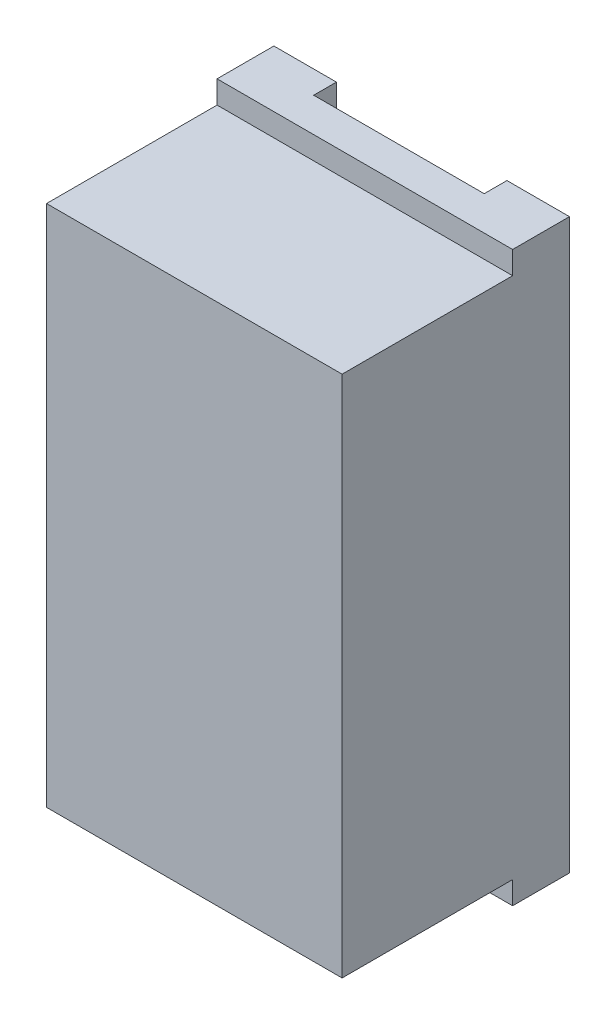
ISO-10303-21;
HEADER;
FILE_DESCRIPTION(('STEP AP214'),'2;1');
FILE_NAME('part.step','',(''),(''),'','','');
FILE_SCHEMA(('AUTOMOTIVE_DESIGN { 1 0 10303 214 1 1 1 1 }'));
ENDSEC;
DATA;
#1=APPLICATION_CONTEXT('core data for automotive mechanical design processes');
#2=APPLICATION_PROTOCOL_DEFINITION('international standard','automotive_design',2000,#1);
#3=PRODUCT_CONTEXT('',#1,'mechanical');
#4=PRODUCT('Part','Part','',(#3));
#5=PRODUCT_RELATED_PRODUCT_CATEGORY('part','',(#4));
#6=PRODUCT_DEFINITION_FORMATION('','',#4);
#7=PRODUCT_DEFINITION_CONTEXT('part definition',#1,'design');
#8=PRODUCT_DEFINITION('design','',#6,#7);
#9=PRODUCT_DEFINITION_SHAPE('','',#8);
#10=(LENGTH_UNIT() NAMED_UNIT(*) SI_UNIT(.MILLI.,.METRE.));
#11=(NAMED_UNIT(*) PLANE_ANGLE_UNIT() SI_UNIT($,.RADIAN.));
#12=(NAMED_UNIT(*) SI_UNIT($,.STERADIAN.) SOLID_ANGLE_UNIT());
#13=UNCERTAINTY_MEASURE_WITH_UNIT(LENGTH_MEASURE(1.E-05),#10,'distance_accuracy_value','');
#14=(GEOMETRIC_REPRESENTATION_CONTEXT(3) GLOBAL_UNCERTAINTY_ASSIGNED_CONTEXT((#13)) GLOBAL_UNIT_ASSIGNED_CONTEXT((#10,
#11,#12)) REPRESENTATION_CONTEXT('',''));
#15=CARTESIAN_POINT('',(0.,0.,0.));
#16=DIRECTION('',(0.,0.,1.));
#17=DIRECTION('',(1.,0.,0.));
#18=AXIS2_PLACEMENT_3D('',#15,#16,#17);
#19=CARTESIAN_POINT('',(13.,-48.,-20.));
#20=DIRECTION('',(0.,1.,0.));
#21=DIRECTION('',(0.,0.,1.));
#22=AXIS2_PLACEMENT_3D('',#19,#20,#21);
#23=PLANE('',#22);
#24=DIRECTION('',(0.,0.,-1.));
#25=VECTOR('',#24,1.);
#26=CARTESIAN_POINT('',(-7.5,-48.,-20.));
#27=LINE('',#26,#25);
#28=CARTESIAN_POINT('',(-7.5,-48.,-18.));
#29=VERTEX_POINT('',#28);
#30=CARTESIAN_POINT('',(-7.5,-48.,-20.));
#31=VERTEX_POINT('',#30);
#32=EDGE_CURVE('E210',#29,#31,#27,.T.);
#33=ORIENTED_EDGE('',*,*,#32,.F.);
#34=DIRECTION('',(1.,0.,0.));
#35=VECTOR('',#34,1.);
#36=CARTESIAN_POINT('',(13.,-48.,-18.));
#37=LINE('',#36,#35);
#38=CARTESIAN_POINT('',(7.5,-48.,-18.));
#39=VERTEX_POINT('',#38);
#40=EDGE_CURVE('E147',#29,#39,#37,.T.);
#41=ORIENTED_EDGE('',*,*,#40,.T.);
#42=DIRECTION('',(0.,0.,-1.));
#43=VECTOR('',#42,1.);
#44=CARTESIAN_POINT('',(7.5,-48.,-20.));
#45=LINE('',#44,#43);
#46=CARTESIAN_POINT('',(7.5,-48.,-20.));
#47=VERTEX_POINT('',#46);
#48=EDGE_CURVE('E201',#39,#47,#45,.T.);
#49=ORIENTED_EDGE('',*,*,#48,.T.);
#50=DIRECTION('',(-1.,0.,0.));
#51=VECTOR('',#50,1.);
#52=CARTESIAN_POINT('',(13.,-48.,-20.));
#53=LINE('',#52,#51);
#54=CARTESIAN_POINT('',(13.,-48.,-20.));
#55=VERTEX_POINT('',#54);
#56=EDGE_CURVE('E167',#55,#47,#53,.T.);
#57=ORIENTED_EDGE('',*,*,#56,.F.);
#58=DIRECTION('',(0.,0.,-1.));
#59=VECTOR('',#58,1.);
#60=CARTESIAN_POINT('',(13.,-48.,-20.));
#61=LINE('',#60,#59);
#62=CARTESIAN_POINT('',(13.,-48.,-15.));
#63=VERTEX_POINT('',#62);
#64=EDGE_CURVE('E217',#63,#55,#61,.T.);
#65=ORIENTED_EDGE('',*,*,#64,.F.);
#66=DIRECTION('',(-1.,0.,0.));
#67=VECTOR('',#66,1.);
#68=CARTESIAN_POINT('',(13.,-48.,-15.));
#69=LINE('',#68,#67);
#70=CARTESIAN_POINT('',(-13.,-48.,-15.));
#71=VERTEX_POINT('',#70);
#72=EDGE_CURVE('E170',#63,#71,#69,.T.);
#73=ORIENTED_EDGE('',*,*,#72,.T.);
#74=DIRECTION('',(0.,0.,-1.));
#75=VECTOR('',#74,1.);
#76=CARTESIAN_POINT('',(-13.,-48.,-20.));
#77=LINE('',#76,#75);
#78=CARTESIAN_POINT('',(-13.,-48.,-20.));
#79=VERTEX_POINT('',#78);
#80=EDGE_CURVE('E151',#71,#79,#77,.T.);
#81=ORIENTED_EDGE('',*,*,#80,.T.);
#82=EDGE_CURVE('E166',#31,#79,#53,.T.);
#83=ORIENTED_EDGE('',*,*,#82,.F.);
#84=EDGE_LOOP('',(#33,#41,#49,#57,#65,#73,#81,#83));
#85=FACE_BOUND('',#84,.T.);
#86=ADVANCED_FACE('F33',(#85),#23,.F.);
#87=CARTESIAN_POINT('',(13.,2.,-20.));
#88=DIRECTION('',(0.,0.,1.));
#89=DIRECTION('',(0.,-1.,0.));
#90=AXIS2_PLACEMENT_3D('',#87,#88,#89);
#91=PLANE('',#90);
#92=DIRECTION('',(0.,1.,0.));
#93=VECTOR('',#92,1.);
#94=CARTESIAN_POINT('',(-7.5,2.,-20.));
#95=LINE('',#94,#93);
#96=CARTESIAN_POINT('',(-7.5,2.,-20.));
#97=VERTEX_POINT('',#96);
#98=EDGE_CURVE('E207',#31,#97,#95,.T.);
#99=ORIENTED_EDGE('',*,*,#98,.F.);
#100=ORIENTED_EDGE('',*,*,#82,.T.);
#101=DIRECTION('',(0.,1.,0.));
#102=VECTOR('',#101,1.);
#103=CARTESIAN_POINT('',(-13.,2.,-20.));
#104=LINE('',#103,#102);
#105=CARTESIAN_POINT('',(-13.,2.,-20.));
#106=VERTEX_POINT('',#105);
#107=EDGE_CURVE('E154',#79,#106,#104,.T.);
#108=ORIENTED_EDGE('',*,*,#107,.T.);
#109=DIRECTION('',(-1.,0.,0.));
#110=VECTOR('',#109,1.);
#111=CARTESIAN_POINT('',(13.,2.,-20.));
#112=LINE('',#111,#110);
#113=EDGE_CURVE('E134',#97,#106,#112,.T.);
#114=ORIENTED_EDGE('',*,*,#113,.F.);
#115=EDGE_LOOP('',(#99,#100,#108,#114));
#116=FACE_BOUND('',#115,.T.);
#117=ADVANCED_FACE('F235',(#116),#91,.F.);
#118=CARTESIAN_POINT('',(13.,2.,-15.));
#119=DIRECTION('',(0.,-1.,0.));
#120=DIRECTION('',(0.,0.,-1.));
#121=AXIS2_PLACEMENT_3D('',#118,#119,#120);
#122=PLANE('',#121);
#123=DIRECTION('',(0.,0.,1.));
#124=VECTOR('',#123,1.);
#125=CARTESIAN_POINT('',(-7.5,2.,-15.));
#126=LINE('',#125,#124);
#127=CARTESIAN_POINT('',(-7.5,2.,-18.));
#128=VERTEX_POINT('',#127);
#129=EDGE_CURVE('E11',#97,#128,#126,.T.);
#130=ORIENTED_EDGE('',*,*,#129,.F.);
#131=ORIENTED_EDGE('',*,*,#113,.T.);
#132=DIRECTION('',(0.,0.,1.));
#133=VECTOR('',#132,1.);
#134=CARTESIAN_POINT('',(-13.,2.,-15.));
#135=LINE('',#134,#133);
#136=CARTESIAN_POINT('',(-13.,2.,-15.));
#137=VERTEX_POINT('',#136);
#138=EDGE_CURVE('E131',#106,#137,#135,.T.);
#139=ORIENTED_EDGE('',*,*,#138,.T.);
#140=DIRECTION('',(-1.,0.,0.));
#141=VECTOR('',#140,1.);
#142=CARTESIAN_POINT('',(13.,2.,-15.));
#143=LINE('',#142,#141);
#144=CARTESIAN_POINT('',(13.,2.,-15.));
#145=VERTEX_POINT('',#144);
#146=EDGE_CURVE('E127',#145,#137,#143,.T.);
#147=ORIENTED_EDGE('',*,*,#146,.F.);
#148=DIRECTION('',(0.,0.,1.));
#149=VECTOR('',#148,1.);
#150=CARTESIAN_POINT('',(13.,2.,-15.));
#151=LINE('',#150,#149);
#152=CARTESIAN_POINT('',(13.,2.,-20.));
#153=VERTEX_POINT('',#152);
#154=EDGE_CURVE('E114',#153,#145,#151,.T.);
#155=ORIENTED_EDGE('',*,*,#154,.F.);
#156=CARTESIAN_POINT('',(7.5,2.,-20.));
#157=VERTEX_POINT('',#156);
#158=EDGE_CURVE('E164',#153,#157,#112,.T.);
#159=ORIENTED_EDGE('',*,*,#158,.T.);
#160=DIRECTION('',(0.,0.,1.));
#161=VECTOR('',#160,1.);
#162=CARTESIAN_POINT('',(7.5,2.,-15.));
#163=LINE('',#162,#161);
#164=CARTESIAN_POINT('',(7.5,2.,-18.));
#165=VERTEX_POINT('',#164);
#166=EDGE_CURVE('E178',#157,#165,#163,.T.);
#167=ORIENTED_EDGE('',*,*,#166,.T.);
#168=DIRECTION('',(-1.,0.,0.));
#169=VECTOR('',#168,1.);
#170=CARTESIAN_POINT('',(13.,2.,-18.));
#171=LINE('',#170,#169);
#172=EDGE_CURVE('E41',#165,#128,#171,.T.);
#173=ORIENTED_EDGE('',*,*,#172,.T.);
#174=EDGE_LOOP('',(#130,#131,#139,#147,#155,#159,#167,#173));
#175=FACE_BOUND('',#174,.T.);
#176=ADVANCED_FACE('F129',(#175),#122,.F.);
#177=CARTESIAN_POINT('',(13.,-46.,0.));
#178=DIRECTION('',(0.,0.,-1.));
#179=DIRECTION('',(-1.,0.,0.));
#180=AXIS2_PLACEMENT_3D('',#177,#178,#179);
#181=PLANE('',#180);
#182=DIRECTION('',(0.,-1.,0.));
#183=VECTOR('',#182,1.);
#184=CARTESIAN_POINT('',(-13.,-46.,0.));
#185=LINE('',#184,#183);
#186=CARTESIAN_POINT('',(-13.,0.,0.));
#187=VERTEX_POINT('',#186);
#188=CARTESIAN_POINT('',(-13.,-46.,0.));
#189=VERTEX_POINT('',#188);
#190=EDGE_CURVE('E143',#187,#189,#185,.T.);
#191=ORIENTED_EDGE('',*,*,#190,.T.);
#192=DIRECTION('',(-1.,0.,0.));
#193=VECTOR('',#192,1.);
#194=CARTESIAN_POINT('',(13.,-46.,0.));
#195=LINE('',#194,#193);
#196=CARTESIAN_POINT('',(13.,-46.,0.));
#197=VERTEX_POINT('',#196);
#198=EDGE_CURVE('E176',#197,#189,#195,.T.);
#199=ORIENTED_EDGE('',*,*,#198,.F.);
#200=DIRECTION('',(0.,-1.,0.));
#201=VECTOR('',#200,1.);
#202=CARTESIAN_POINT('',(13.,-46.,0.));
#203=LINE('',#202,#201);
#204=CARTESIAN_POINT('',(13.,0.,0.));
#205=VERTEX_POINT('',#204);
#206=EDGE_CURVE('E161',#205,#197,#203,.T.);
#207=ORIENTED_EDGE('',*,*,#206,.F.);
#208=DIRECTION('',(-1.,0.,0.));
#209=VECTOR('',#208,1.);
#210=CARTESIAN_POINT('',(13.,0.,0.));
#211=LINE('',#210,#209);
#212=EDGE_CURVE('E139',#205,#187,#211,.T.);
#213=ORIENTED_EDGE('',*,*,#212,.T.);
#214=EDGE_LOOP('',(#191,#199,#207,#213));
#215=FACE_BOUND('',#214,.T.);
#216=ADVANCED_FACE('F35',(#215),#181,.F.);
#217=CARTESIAN_POINT('',(13.,-46.,-15.));
#218=DIRECTION('',(0.,1.,0.));
#219=DIRECTION('',(0.,0.,1.));
#220=AXIS2_PLACEMENT_3D('',#217,#218,#219);
#221=PLANE('',#220);
#222=DIRECTION('',(0.,0.,-1.));
#223=VECTOR('',#222,1.);
#224=CARTESIAN_POINT('',(-13.,-46.,-15.));
#225=LINE('',#224,#223);
#226=CARTESIAN_POINT('',(-13.,-46.,-15.));
#227=VERTEX_POINT('',#226);
#228=EDGE_CURVE('E146',#189,#227,#225,.T.);
#229=ORIENTED_EDGE('',*,*,#228,.T.);
#230=DIRECTION('',(-1.,0.,0.));
#231=VECTOR('',#230,1.);
#232=CARTESIAN_POINT('',(13.,-46.,-15.));
#233=LINE('',#232,#231);
#234=CARTESIAN_POINT('',(13.,-46.,-15.));
#235=VERTEX_POINT('',#234);
#236=EDGE_CURVE('E173',#235,#227,#233,.T.);
#237=ORIENTED_EDGE('',*,*,#236,.F.);
#238=DIRECTION('',(0.,0.,-1.));
#239=VECTOR('',#238,1.);
#240=CARTESIAN_POINT('',(13.,-46.,-15.));
#241=LINE('',#240,#239);
#242=EDGE_CURVE('E99',#197,#235,#241,.T.);
#243=ORIENTED_EDGE('',*,*,#242,.F.);
#244=ORIENTED_EDGE('',*,*,#198,.T.);
#245=EDGE_LOOP('',(#229,#237,#243,#244));
#246=FACE_BOUND('',#245,.T.);
#247=ADVANCED_FACE('F246',(#246),#221,.F.);
#248=CARTESIAN_POINT('',(13.,-48.,-15.));
#249=DIRECTION('',(0.,0.,-1.));
#250=DIRECTION('',(-1.,0.,0.));
#251=AXIS2_PLACEMENT_3D('',#248,#249,#250);
#252=PLANE('',#251);
#253=DIRECTION('',(0.,-1.,0.));
#254=VECTOR('',#253,1.);
#255=CARTESIAN_POINT('',(-13.,-48.,-15.));
#256=LINE('',#255,#254);
#257=EDGE_CURVE('E149',#227,#71,#256,.T.);
#258=ORIENTED_EDGE('',*,*,#257,.T.);
#259=ORIENTED_EDGE('',*,*,#72,.F.);
#260=DIRECTION('',(0.,-1.,0.));
#261=VECTOR('',#260,1.);
#262=CARTESIAN_POINT('',(13.,-48.,-15.));
#263=LINE('',#262,#261);
#264=EDGE_CURVE('E215',#235,#63,#263,.T.);
#265=ORIENTED_EDGE('',*,*,#264,.F.);
#266=ORIENTED_EDGE('',*,*,#236,.T.);
#267=EDGE_LOOP('',(#258,#259,#265,#266));
#268=FACE_BOUND('',#267,.T.);
#269=ADVANCED_FACE('F248',(#268),#252,.F.);
#270=ORIENTED_EDGE('',*,*,#56,.T.);
#271=DIRECTION('',(0.,1.,0.));
#272=VECTOR('',#271,1.);
#273=CARTESIAN_POINT('',(7.5,2.,-20.));
#274=LINE('',#273,#272);
#275=EDGE_CURVE('E198',#47,#157,#274,.T.);
#276=ORIENTED_EDGE('',*,*,#275,.T.);
#277=ORIENTED_EDGE('',*,*,#158,.F.);
#278=DIRECTION('',(0.,1.,0.));
#279=VECTOR('',#278,1.);
#280=CARTESIAN_POINT('',(13.,2.,-20.));
#281=LINE('',#280,#279);
#282=EDGE_CURVE('E121',#55,#153,#281,.T.);
#283=ORIENTED_EDGE('',*,*,#282,.F.);
#284=EDGE_LOOP('',(#270,#276,#277,#283));
#285=FACE_BOUND('',#284,.T.);
#286=ADVANCED_FACE('F224',(#285),#91,.F.);
#287=CARTESIAN_POINT('',(13.,0.,-15.));
#288=DIRECTION('',(0.,0.,-1.));
#289=DIRECTION('',(-1.,0.,0.));
#290=AXIS2_PLACEMENT_3D('',#287,#288,#289);
#291=PLANE('',#290);
#292=DIRECTION('',(0.,-1.,0.));
#293=VECTOR('',#292,1.);
#294=CARTESIAN_POINT('',(-13.,0.,-15.));
#295=LINE('',#294,#293);
#296=CARTESIAN_POINT('',(-13.,0.,-15.));
#297=VERTEX_POINT('',#296);
#298=EDGE_CURVE('E158',#137,#297,#295,.T.);
#299=ORIENTED_EDGE('',*,*,#298,.T.);
#300=DIRECTION('',(-1.,0.,0.));
#301=VECTOR('',#300,1.);
#302=CARTESIAN_POINT('',(13.,0.,-15.));
#303=LINE('',#302,#301);
#304=CARTESIAN_POINT('',(13.,0.,-15.));
#305=VERTEX_POINT('',#304);
#306=EDGE_CURVE('E135',#305,#297,#303,.T.);
#307=ORIENTED_EDGE('',*,*,#306,.F.);
#308=DIRECTION('',(0.,-1.,0.));
#309=VECTOR('',#308,1.);
#310=CARTESIAN_POINT('',(13.,0.,-15.));
#311=LINE('',#310,#309);
#312=EDGE_CURVE('E118',#145,#305,#311,.T.);
#313=ORIENTED_EDGE('',*,*,#312,.F.);
#314=ORIENTED_EDGE('',*,*,#146,.T.);
#315=EDGE_LOOP('',(#299,#307,#313,#314));
#316=FACE_BOUND('',#315,.T.);
#317=ADVANCED_FACE('F137',(#316),#291,.F.);
#318=CARTESIAN_POINT('',(13.,0.,0.));
#319=DIRECTION('',(0.,-1.,0.));
#320=DIRECTION('',(0.,0.,-1.));
#321=AXIS2_PLACEMENT_3D('',#318,#319,#320);
#322=PLANE('',#321);
#323=DIRECTION('',(0.,0.,1.));
#324=VECTOR('',#323,1.);
#325=CARTESIAN_POINT('',(-13.,0.,0.));
#326=LINE('',#325,#324);
#327=EDGE_CURVE('E90',#297,#187,#326,.T.);
#328=ORIENTED_EDGE('',*,*,#327,.T.);
#329=ORIENTED_EDGE('',*,*,#212,.F.);
#330=DIRECTION('',(0.,0.,1.));
#331=VECTOR('',#330,1.);
#332=CARTESIAN_POINT('',(13.,0.,0.));
#333=LINE('',#332,#331);
#334=EDGE_CURVE('E57',#305,#205,#333,.T.);
#335=ORIENTED_EDGE('',*,*,#334,.F.);
#336=ORIENTED_EDGE('',*,*,#306,.T.);
#337=EDGE_LOOP('',(#328,#329,#335,#336));
#338=FACE_BOUND('',#337,.T.);
#339=ADVANCED_FACE('F242',(#338),#322,.F.);
#340=CARTESIAN_POINT('',(13.,0.,0.));
#341=DIRECTION('',(-1.,0.,0.));
#342=DIRECTION('',(0.,0.,1.));
#343=AXIS2_PLACEMENT_3D('',#340,#341,#342);
#344=PLANE('',#343);
#345=ORIENTED_EDGE('',*,*,#206,.T.);
#346=ORIENTED_EDGE('',*,*,#242,.T.);
#347=ORIENTED_EDGE('',*,*,#264,.T.);
#348=ORIENTED_EDGE('',*,*,#64,.T.);
#349=ORIENTED_EDGE('',*,*,#282,.T.);
#350=ORIENTED_EDGE('',*,*,#154,.T.);
#351=ORIENTED_EDGE('',*,*,#312,.T.);
#352=ORIENTED_EDGE('',*,*,#334,.T.);
#353=EDGE_LOOP('',(#345,#346,#347,#348,#349,#350,#351,#352));
#354=FACE_BOUND('',#353,.T.);
#355=ADVANCED_FACE('F116',(#354),#344,.F.);
#356=CARTESIAN_POINT('',(-13.,0.,0.));
#357=DIRECTION('',(-1.,0.,0.));
#358=DIRECTION('',(0.,0.,1.));
#359=AXIS2_PLACEMENT_3D('',#356,#357,#358);
#360=PLANE('',#359);
#361=ORIENTED_EDGE('',*,*,#190,.F.);
#362=ORIENTED_EDGE('',*,*,#327,.F.);
#363=ORIENTED_EDGE('',*,*,#298,.F.);
#364=ORIENTED_EDGE('',*,*,#138,.F.);
#365=ORIENTED_EDGE('',*,*,#107,.F.);
#366=ORIENTED_EDGE('',*,*,#80,.F.);
#367=ORIENTED_EDGE('',*,*,#257,.F.);
#368=ORIENTED_EDGE('',*,*,#228,.F.);
#369=EDGE_LOOP('',(#361,#362,#363,#364,#365,#366,#367,#368));
#370=FACE_BOUND('',#369,.T.);
#371=ADVANCED_FACE('F241',(#370),#360,.T.);
#372=CARTESIAN_POINT('',(-7.5,6.21397044713107,-18.));
#373=DIRECTION('',(0.,0.,1.));
#374=DIRECTION('',(0.,-1.,0.));
#375=AXIS2_PLACEMENT_3D('',#372,#373,#374);
#376=PLANE('',#375);
#377=DIRECTION('',(0.,-1.,0.));
#378=VECTOR('',#377,1.);
#379=CARTESIAN_POINT('',(-7.5,6.21397044713107,-18.));
#380=LINE('',#379,#378);
#381=EDGE_CURVE('E194',#128,#29,#380,.T.);
#382=ORIENTED_EDGE('',*,*,#381,.F.);
#383=ORIENTED_EDGE('',*,*,#172,.F.);
#384=DIRECTION('',(0.,-1.,0.));
#385=VECTOR('',#384,1.);
#386=CARTESIAN_POINT('',(7.5,6.21397044713107,-18.));
#387=LINE('',#386,#385);
#388=EDGE_CURVE('E48',#165,#39,#387,.T.);
#389=ORIENTED_EDGE('',*,*,#388,.T.);
#390=ORIENTED_EDGE('',*,*,#40,.F.);
#391=EDGE_LOOP('',(#382,#383,#389,#390));
#392=FACE_BOUND('',#391,.T.);
#393=ADVANCED_FACE('F189',(#392),#376,.F.);
#394=CARTESIAN_POINT('',(-7.5,0.,0.));
#395=DIRECTION('',(1.,0.,0.));
#396=DIRECTION('',(0.,0.,-1.));
#397=AXIS2_PLACEMENT_3D('',#394,#395,#396);
#398=PLANE('',#397);
#399=ORIENTED_EDGE('',*,*,#32,.T.);
#400=ORIENTED_EDGE('',*,*,#98,.T.);
#401=ORIENTED_EDGE('',*,*,#129,.T.);
#402=ORIENTED_EDGE('',*,*,#381,.T.);
#403=EDGE_LOOP('',(#399,#400,#401,#402));
#404=FACE_BOUND('',#403,.T.);
#405=ADVANCED_FACE('F232',(#404),#398,.T.);
#406=CARTESIAN_POINT('',(7.5,0.,0.));
#407=DIRECTION('',(1.,0.,0.));
#408=DIRECTION('',(0.,0.,-1.));
#409=AXIS2_PLACEMENT_3D('',#406,#407,#408);
#410=PLANE('',#409);
#411=ORIENTED_EDGE('',*,*,#388,.F.);
#412=ORIENTED_EDGE('',*,*,#166,.F.);
#413=ORIENTED_EDGE('',*,*,#275,.F.);
#414=ORIENTED_EDGE('',*,*,#48,.F.);
#415=EDGE_LOOP('',(#411,#412,#413,#414));
#416=FACE_BOUND('',#415,.T.);
#417=ADVANCED_FACE('F276',(#416),#410,.F.);
#418=CLOSED_SHELL('',(#86,#117,#176,#216,#247,#269,#286,#317,#339,#355,#371,#393,#405,#417));
#419=MANIFOLD_SOLID_BREP('B2',#418);
#420=ADVANCED_BREP_SHAPE_REPRESENTATION('',(#18,#419),#14);
#421=SHAPE_DEFINITION_REPRESENTATION(#9,#420);
ENDSEC;
END-ISO-10303-21;
